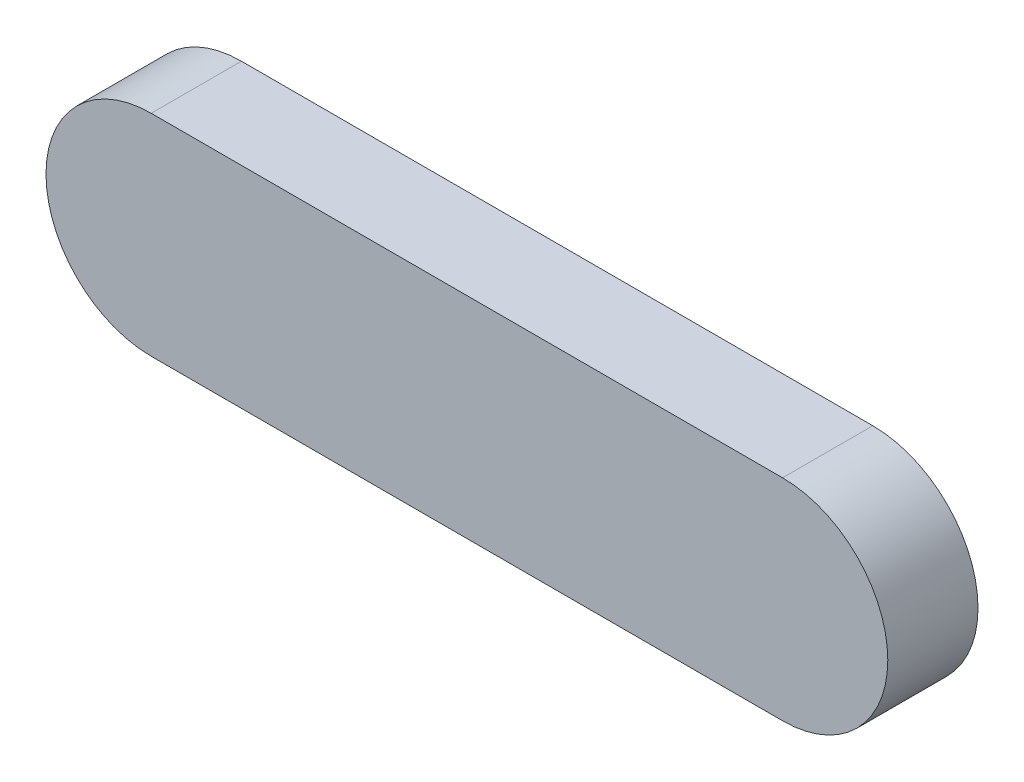
ISO-10303-21;
HEADER;
FILE_DESCRIPTION(('STEP AP214'),'2;1');
FILE_NAME('part.step','',(''),(''),'','','');
FILE_SCHEMA(('AUTOMOTIVE_DESIGN { 1 0 10303 214 1 1 1 1 }'));
ENDSEC;
DATA;
#1=APPLICATION_CONTEXT('core data for automotive mechanical design processes');
#2=APPLICATION_PROTOCOL_DEFINITION('international standard','automotive_design',2000,#1);
#3=PRODUCT_CONTEXT('',#1,'mechanical');
#4=PRODUCT('Part','Part','',(#3));
#5=PRODUCT_RELATED_PRODUCT_CATEGORY('part','',(#4));
#6=PRODUCT_DEFINITION_FORMATION('','',#4);
#7=PRODUCT_DEFINITION_CONTEXT('part definition',#1,'design');
#8=PRODUCT_DEFINITION('design','',#6,#7);
#9=PRODUCT_DEFINITION_SHAPE('','',#8);
#10=(LENGTH_UNIT() NAMED_UNIT(*) SI_UNIT(.MILLI.,.METRE.));
#11=(NAMED_UNIT(*) PLANE_ANGLE_UNIT() SI_UNIT($,.RADIAN.));
#12=(NAMED_UNIT(*) SI_UNIT($,.STERADIAN.) SOLID_ANGLE_UNIT());
#13=UNCERTAINTY_MEASURE_WITH_UNIT(LENGTH_MEASURE(1.E-05),#10,'distance_accuracy_value','');
#14=(GEOMETRIC_REPRESENTATION_CONTEXT(3) GLOBAL_UNCERTAINTY_ASSIGNED_CONTEXT((#13)) GLOBAL_UNIT_ASSIGNED_CONTEXT((#10,
#11,#12)) REPRESENTATION_CONTEXT('',''));
#15=CARTESIAN_POINT('',(0.,0.,0.));
#16=DIRECTION('',(0.,0.,1.));
#17=DIRECTION('',(1.,0.,0.));
#18=AXIS2_PLACEMENT_3D('',#15,#16,#17);
#19=CARTESIAN_POINT('',(7.3321648752938,1.0334489337179,0.));
#20=DIRECTION('',(0.,-1.,0.));
#21=DIRECTION('',(1.,0.,0.));
#22=AXIS2_PLACEMENT_3D('',#19,#20,#21);
#23=PLANE('',#22);
#24=DIRECTION('',(-1.,0.,0.));
#25=VECTOR('',#24,1.);
#26=CARTESIAN_POINT('',(8.0320048752938,1.0334489337179,0.));
#27=LINE('',#26,#25);
#28=CARTESIAN_POINT('',(8.0320048752938,1.0334489337179,0.));
#29=VERTEX_POINT('',#28);
#30=CARTESIAN_POINT('',(7.3321648752938,1.0334489337179,0.));
#31=VERTEX_POINT('',#30);
#32=EDGE_CURVE('E11',#29,#31,#27,.T.);
#33=ORIENTED_EDGE('',*,*,#32,.F.);
#34=DIRECTION('',(0.,0.,1.));
#35=VECTOR('',#34,1.);
#36=CARTESIAN_POINT('',(8.0320048752938,1.0334489337179,0.));
#37=LINE('',#36,#35);
#38=CARTESIAN_POINT('',(8.0320048752938,1.0334489337179,0.1));
#39=VERTEX_POINT('',#38);
#40=EDGE_CURVE('E24',#29,#39,#37,.T.);
#41=ORIENTED_EDGE('',*,*,#40,.T.);
#42=DIRECTION('',(1.,0.,0.));
#43=VECTOR('',#42,1.);
#44=CARTESIAN_POINT('',(8.0320048752938,1.0334489337179,0.1));
#45=LINE('',#44,#43);
#46=CARTESIAN_POINT('',(7.3321648752938,1.0334489337179,0.1));
#47=VERTEX_POINT('',#46);
#48=EDGE_CURVE('E75',#47,#39,#45,.T.);
#49=ORIENTED_EDGE('',*,*,#48,.F.);
#50=DIRECTION('',(0.,0.,1.));
#51=VECTOR('',#50,1.);
#52=CARTESIAN_POINT('',(7.3321648752938,1.0334489337179,0.));
#53=LINE('',#52,#51);
#54=EDGE_CURVE('E85',#31,#47,#53,.T.);
#55=ORIENTED_EDGE('',*,*,#54,.F.);
#56=EDGE_LOOP('',(#33,#41,#49,#55));
#57=FACE_BOUND('',#56,.T.);
#58=ADVANCED_FACE('F17',(#57),#23,.T.);
#59=CARTESIAN_POINT('',(7.3321648752938,1.1500889337179,0.));
#60=DIRECTION('',(0.,0.,1.));
#61=DIRECTION('',(0.,-1.,0.));
#62=AXIS2_PLACEMENT_3D('',#59,#60,#61);
#63=CYLINDRICAL_SURFACE('',#62,0.11664);
#64=CARTESIAN_POINT('',(7.3321648752938,1.1500889337179,0.));
#65=DIRECTION('',(0.,0.,-1.));
#66=DIRECTION('',(1.,0.,0.));
#67=AXIS2_PLACEMENT_3D('',#64,#65,#66);
#68=CIRCLE('',#67,0.11664);
#69=CARTESIAN_POINT('',(7.3321648752938,1.2667289337179,0.));
#70=VERTEX_POINT('',#69);
#71=EDGE_CURVE('E83',#31,#70,#68,.T.);
#72=ORIENTED_EDGE('',*,*,#71,.F.);
#73=ORIENTED_EDGE('',*,*,#54,.T.);
#74=CARTESIAN_POINT('',(7.3321648752938,1.1500889337179,0.1));
#75=DIRECTION('',(0.,0.,1.));
#76=DIRECTION('',(0.,-1.,0.));
#77=AXIS2_PLACEMENT_3D('',#74,#75,#76);
#78=CIRCLE('',#77,0.11664);
#79=CARTESIAN_POINT('',(7.3321648752938,1.2667289337179,0.1));
#80=VERTEX_POINT('',#79);
#81=EDGE_CURVE('E81',#80,#47,#78,.T.);
#82=ORIENTED_EDGE('',*,*,#81,.F.);
#83=DIRECTION('',(0.,0.,1.));
#84=VECTOR('',#83,1.);
#85=CARTESIAN_POINT('',(7.3321648752938,1.2667289337179,0.));
#86=LINE('',#85,#84);
#87=EDGE_CURVE('E61',#70,#80,#86,.T.);
#88=ORIENTED_EDGE('',*,*,#87,.F.);
#89=EDGE_LOOP('',(#72,#73,#82,#88));
#90=FACE_BOUND('',#89,.T.);
#91=ADVANCED_FACE('F91',(#90),#63,.T.);
#92=CARTESIAN_POINT('',(8.0320048752938,1.2667289337179,0.));
#93=DIRECTION('',(0.,1.,0.));
#94=DIRECTION('',(-1.,0.,0.));
#95=AXIS2_PLACEMENT_3D('',#92,#93,#94);
#96=PLANE('',#95);
#97=DIRECTION('',(1.,0.,0.));
#98=VECTOR('',#97,1.);
#99=CARTESIAN_POINT('',(7.3321648752938,1.2667289337179,0.));
#100=LINE('',#99,#98);
#101=CARTESIAN_POINT('',(8.0320048752938,1.2667289337179,0.));
#102=VERTEX_POINT('',#101);
#103=EDGE_CURVE('E65',#70,#102,#100,.T.);
#104=ORIENTED_EDGE('',*,*,#103,.F.);
#105=ORIENTED_EDGE('',*,*,#87,.T.);
#106=DIRECTION('',(-1.,0.,0.));
#107=VECTOR('',#106,1.);
#108=CARTESIAN_POINT('',(7.3321648752938,1.2667289337179,0.1));
#109=LINE('',#108,#107);
#110=CARTESIAN_POINT('',(8.0320048752938,1.2667289337179,0.1));
#111=VERTEX_POINT('',#110);
#112=EDGE_CURVE('E54',#111,#80,#109,.T.);
#113=ORIENTED_EDGE('',*,*,#112,.F.);
#114=DIRECTION('',(0.,0.,1.));
#115=VECTOR('',#114,1.);
#116=CARTESIAN_POINT('',(8.0320048752938,1.2667289337179,0.));
#117=LINE('',#116,#115);
#118=EDGE_CURVE('E58',#102,#111,#117,.T.);
#119=ORIENTED_EDGE('',*,*,#118,.F.);
#120=EDGE_LOOP('',(#104,#105,#113,#119));
#121=FACE_BOUND('',#120,.T.);
#122=ADVANCED_FACE('F57',(#121),#96,.T.);
#123=CARTESIAN_POINT('',(8.0320048752938,1.1500889337179,0.));
#124=DIRECTION('',(0.,0.,1.));
#125=DIRECTION('',(0.,1.,0.));
#126=AXIS2_PLACEMENT_3D('',#123,#124,#125);
#127=CYLINDRICAL_SURFACE('',#126,0.11664);
#128=CARTESIAN_POINT('',(8.0320048752938,1.1500889337179,0.));
#129=DIRECTION('',(0.,0.,-1.));
#130=DIRECTION('',(0.,1.,0.));
#131=AXIS2_PLACEMENT_3D('',#128,#129,#130);
#132=CIRCLE('',#131,0.11664);
#133=EDGE_CURVE('E71',#102,#29,#132,.T.);
#134=ORIENTED_EDGE('',*,*,#133,.F.);
#135=ORIENTED_EDGE('',*,*,#118,.T.);
#136=CARTESIAN_POINT('',(8.0320048752938,1.1500889337179,0.1));
#137=DIRECTION('',(0.,0.,1.));
#138=DIRECTION('',(0.,1.,0.));
#139=AXIS2_PLACEMENT_3D('',#136,#137,#138);
#140=CIRCLE('',#139,0.11664);
#141=EDGE_CURVE('E70',#39,#111,#140,.T.);
#142=ORIENTED_EDGE('',*,*,#141,.F.);
#143=ORIENTED_EDGE('',*,*,#40,.F.);
#144=EDGE_LOOP('',(#134,#135,#142,#143));
#145=FACE_BOUND('',#144,.T.);
#146=ADVANCED_FACE('F69',(#145),#127,.T.);
#147=CARTESIAN_POINT('',(7.6820848752938,1.1500889337179,0.));
#148=DIRECTION('',(0.,0.,1.));
#149=DIRECTION('',(1.,0.,0.));
#150=AXIS2_PLACEMENT_3D('',#147,#148,#149);
#151=PLANE('',#150);
#152=ORIENTED_EDGE('',*,*,#133,.T.);
#153=ORIENTED_EDGE('',*,*,#32,.T.);
#154=ORIENTED_EDGE('',*,*,#71,.T.);
#155=ORIENTED_EDGE('',*,*,#103,.T.);
#156=EDGE_LOOP('',(#152,#153,#154,#155));
#157=FACE_BOUND('',#156,.T.);
#158=ADVANCED_FACE('F88',(#157),#151,.F.);
#159=CARTESIAN_POINT('',(7.6820848752938,1.1500889337179,0.1));
#160=DIRECTION('',(0.,0.,1.));
#161=DIRECTION('',(1.,0.,0.));
#162=AXIS2_PLACEMENT_3D('',#159,#160,#161);
#163=PLANE('',#162);
#164=ORIENTED_EDGE('',*,*,#141,.T.);
#165=ORIENTED_EDGE('',*,*,#112,.T.);
#166=ORIENTED_EDGE('',*,*,#81,.T.);
#167=ORIENTED_EDGE('',*,*,#48,.T.);
#168=EDGE_LOOP('',(#164,#165,#166,#167));
#169=FACE_BOUND('',#168,.T.);
#170=ADVANCED_FACE('F74',(#169),#163,.T.);
#171=CLOSED_SHELL('',(#58,#91,#122,#146,#158,#170));
#172=MANIFOLD_SOLID_BREP('B1',#171);
#173=ADVANCED_BREP_SHAPE_REPRESENTATION('',(#18,#172),#14);
#174=SHAPE_DEFINITION_REPRESENTATION(#9,#173);
ENDSEC;
END-ISO-10303-21;
